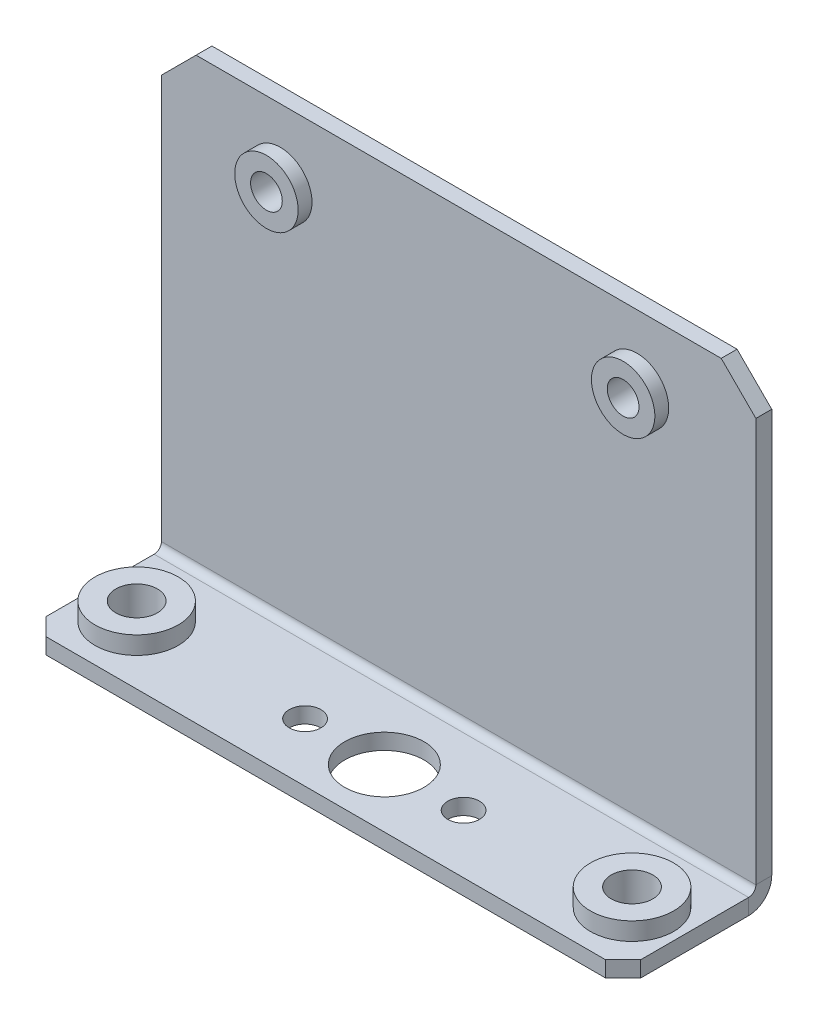
ISO-10303-21;
HEADER;
FILE_DESCRIPTION(('STEP AP214'),'2;1');
FILE_NAME('part.step','',(''),(''),'','','');
FILE_SCHEMA(('AUTOMOTIVE_DESIGN { 1 0 10303 214 1 1 1 1 }'));
ENDSEC;
DATA;
#1=APPLICATION_CONTEXT('core data for automotive mechanical design processes');
#2=APPLICATION_PROTOCOL_DEFINITION('international standard','automotive_design',2000,#1);
#3=PRODUCT_CONTEXT('',#1,'mechanical');
#4=PRODUCT('Part','Part','',(#3));
#5=PRODUCT_RELATED_PRODUCT_CATEGORY('part','',(#4));
#6=PRODUCT_DEFINITION_FORMATION('','',#4);
#7=PRODUCT_DEFINITION_CONTEXT('part definition',#1,'design');
#8=PRODUCT_DEFINITION('design','',#6,#7);
#9=PRODUCT_DEFINITION_SHAPE('','',#8);
#10=(LENGTH_UNIT() NAMED_UNIT(*) SI_UNIT(.MILLI.,.METRE.));
#11=(NAMED_UNIT(*) PLANE_ANGLE_UNIT() SI_UNIT($,.RADIAN.));
#12=(NAMED_UNIT(*) SI_UNIT($,.STERADIAN.) SOLID_ANGLE_UNIT());
#13=UNCERTAINTY_MEASURE_WITH_UNIT(LENGTH_MEASURE(1.E-05),#10,'distance_accuracy_value','');
#14=(GEOMETRIC_REPRESENTATION_CONTEXT(3) GLOBAL_UNCERTAINTY_ASSIGNED_CONTEXT((#13)) GLOBAL_UNIT_ASSIGNED_CONTEXT((#10,
#11,#12)) REPRESENTATION_CONTEXT('',''));
#15=CARTESIAN_POINT('',(0.,0.,0.));
#16=DIRECTION('',(0.,0.,1.));
#17=DIRECTION('',(1.,0.,0.));
#18=AXIS2_PLACEMENT_3D('',#15,#16,#17);
#19=CARTESIAN_POINT('',(30.,0.,0.));
#20=DIRECTION('',(0.,0.,1.));
#21=DIRECTION('',(1.,0.,0.));
#22=AXIS2_PLACEMENT_3D('',#19,#20,#21);
#23=PLANE('',#22);
#24=CARTESIAN_POINT('',(-18.,38.,0.));
#25=DIRECTION('',(0.,0.,1.));
#26=DIRECTION('',(1.,0.,0.));
#27=AXIS2_PLACEMENT_3D('',#24,#25,#26);
#28=CIRCLE('',#27,3.2);
#29=CARTESIAN_POINT('',(-14.8,38.,0.));
#30=VERTEX_POINT('',#29);
#31=EDGE_CURVE('E302',#30,#30,#28,.T.);
#32=ORIENTED_EDGE('',*,*,#31,.F.);
#33=EDGE_LOOP('',(#32));
#34=FACE_BOUND('',#33,.T.);
#35=DIRECTION('',(0.,-1.,0.));
#36=VECTOR('',#35,1.);
#37=CARTESIAN_POINT('',(-30.,41.5,0.));
#38=LINE('',#37,#36);
#39=CARTESIAN_POINT('',(-30.,41.5,0.));
#40=VERTEX_POINT('',#39);
#41=CARTESIAN_POINT('',(-30.,0.736599999999992,0.));
#42=VERTEX_POINT('',#41);
#43=EDGE_CURVE('E189',#40,#42,#38,.T.);
#44=ORIENTED_EDGE('',*,*,#43,.T.);
#45=DIRECTION('',(1.,0.,0.));
#46=VECTOR('',#45,1.);
#47=CARTESIAN_POINT('',(30.,0.736600000000001,0.));
#48=LINE('',#47,#46);
#49=CARTESIAN_POINT('',(30.,0.736599999999997,0.));
#50=VERTEX_POINT('',#49);
#51=EDGE_CURVE('E151',#50,#42,#48,.F.);
#52=ORIENTED_EDGE('',*,*,#51,.F.);
#53=DIRECTION('',(0.,1.,0.));
#54=VECTOR('',#53,1.);
#55=CARTESIAN_POINT('',(30.,41.5,0.));
#56=LINE('',#55,#54);
#57=CARTESIAN_POINT('',(30.,41.5,0.));
#58=VERTEX_POINT('',#57);
#59=EDGE_CURVE('E183',#50,#58,#56,.T.);
#60=ORIENTED_EDGE('',*,*,#59,.T.);
#61=DIRECTION('',(-0.707106781186547,0.707106781186547,0.));
#62=VECTOR('',#61,1.);
#63=CARTESIAN_POINT('',(26.5,45.,0.));
#64=LINE('',#63,#62);
#65=CARTESIAN_POINT('',(26.5,45.,0.));
#66=VERTEX_POINT('',#65);
#67=EDGE_CURVE('E202',#58,#66,#64,.T.);
#68=ORIENTED_EDGE('',*,*,#67,.T.);
#69=DIRECTION('',(-1.,0.,0.));
#70=VECTOR('',#69,1.);
#71=CARTESIAN_POINT('',(-26.5,45.,0.));
#72=LINE('',#71,#70);
#73=CARTESIAN_POINT('',(-26.5,45.,0.));
#74=VERTEX_POINT('',#73);
#75=EDGE_CURVE('E205',#66,#74,#72,.T.);
#76=ORIENTED_EDGE('',*,*,#75,.T.);
#77=DIRECTION('',(-0.707106781186547,-0.707106781186548,0.));
#78=VECTOR('',#77,1.);
#79=CARTESIAN_POINT('',(-30.,41.5,0.));
#80=LINE('',#79,#78);
#81=EDGE_CURVE('E208',#74,#40,#80,.T.);
#82=ORIENTED_EDGE('',*,*,#81,.T.);
#83=EDGE_LOOP('',(#44,#52,#60,#68,#76,#82));
#84=FACE_BOUND('',#83,.T.);
#85=CARTESIAN_POINT('',(18.,38.,0.));
#86=DIRECTION('',(0.,0.,1.));
#87=DIRECTION('',(-1.,0.,0.));
#88=AXIS2_PLACEMENT_3D('',#85,#86,#87);
#89=CIRCLE('',#88,3.2);
#90=CARTESIAN_POINT('',(14.8,38.,0.));
#91=VERTEX_POINT('',#90);
#92=EDGE_CURVE('E308',#91,#91,#89,.T.);
#93=ORIENTED_EDGE('',*,*,#92,.F.);
#94=EDGE_LOOP('',(#93));
#95=FACE_BOUND('',#94,.T.);
#96=ADVANCED_FACE('F36',(#34,#84,#95),#23,.T.);
#97=CARTESIAN_POINT('',(30.,0.,0.));
#98=DIRECTION('',(0.,1.,0.));
#99=DIRECTION('',(0.,0.,1.));
#100=AXIS2_PLACEMENT_3D('',#97,#98,#99);
#101=PLANE('',#100);
#102=CARTESIAN_POINT('',(-25.,0.,7.5));
#103=DIRECTION('',(0.,1.,0.));
#104=DIRECTION('',(0.,0.,1.));
#105=AXIS2_PLACEMENT_3D('',#102,#103,#104);
#106=CIRCLE('',#105,4.2);
#107=CARTESIAN_POINT('',(-25.,0.,11.7));
#108=VERTEX_POINT('',#107);
#109=EDGE_CURVE('E284',#108,#108,#106,.T.);
#110=ORIENTED_EDGE('',*,*,#109,.F.);
#111=EDGE_LOOP('',(#110));
#112=FACE_BOUND('',#111,.T.);
#113=CARTESIAN_POINT('',(0.,0.,7.5));
#114=DIRECTION('',(0.,1.,0.));
#115=DIRECTION('',(0.,0.,1.));
#116=AXIS2_PLACEMENT_3D('',#113,#114,#115);
#117=CIRCLE('',#116,4.);
#118=CARTESIAN_POINT('',(0.,0.,11.5));
#119=VERTEX_POINT('',#118);
#120=EDGE_CURVE('E271',#119,#119,#117,.T.);
#121=ORIENTED_EDGE('',*,*,#120,.F.);
#122=EDGE_LOOP('',(#121));
#123=FACE_BOUND('',#122,.T.);
#124=CARTESIAN_POINT('',(-7.99999999999999,0.,7.5));
#125=DIRECTION('',(0.,1.,0.));
#126=DIRECTION('',(0.,0.,1.));
#127=AXIS2_PLACEMENT_3D('',#124,#125,#126);
#128=CIRCLE('',#127,1.6);
#129=CARTESIAN_POINT('',(-7.99999999999999,0.,9.1));
#130=VERTEX_POINT('',#129);
#131=EDGE_CURVE('E265',#130,#130,#128,.T.);
#132=ORIENTED_EDGE('',*,*,#131,.F.);
#133=EDGE_LOOP('',(#132));
#134=FACE_BOUND('',#133,.T.);
#135=DIRECTION('',(0.,0.,-1.));
#136=VECTOR('',#135,1.);
#137=CARTESIAN_POINT('',(-30.,0.,0.));
#138=LINE('',#137,#136);
#139=CARTESIAN_POINT('',(-30.,0.,11.6224972892438));
#140=VERTEX_POINT('',#139);
#141=CARTESIAN_POINT('',(-30.,0.,0.736599999999996));
#142=VERTEX_POINT('',#141);
#143=EDGE_CURVE('E164',#140,#142,#138,.T.);
#144=ORIENTED_EDGE('',*,*,#143,.F.);
#145=DIRECTION('',(-0.707106781186555,0.,-0.707106781186539));
#146=VECTOR('',#145,1.);
#147=CARTESIAN_POINT('',(-30.,0.,11.6224972892439));
#148=LINE('',#147,#146);
#149=CARTESIAN_POINT('',(-28.2224972892438,0.,13.4));
#150=VERTEX_POINT('',#149);
#151=EDGE_CURVE('E53',#150,#140,#148,.T.);
#152=ORIENTED_EDGE('',*,*,#151,.F.);
#153=DIRECTION('',(-1.,0.,0.));
#154=VECTOR('',#153,1.);
#155=CARTESIAN_POINT('',(-30.,0.,13.4));
#156=LINE('',#155,#154);
#157=CARTESIAN_POINT('',(28.2224972892439,0.,13.4));
#158=VERTEX_POINT('',#157);
#159=EDGE_CURVE('E160',#158,#150,#156,.T.);
#160=ORIENTED_EDGE('',*,*,#159,.F.);
#161=DIRECTION('',(-0.70710678118654,0.,0.707106781186555));
#162=VECTOR('',#161,1.);
#163=CARTESIAN_POINT('',(30.,0.,11.6224972892439));
#164=LINE('',#163,#162);
#165=CARTESIAN_POINT('',(30.,0.,11.6224972892439));
#166=VERTEX_POINT('',#165);
#167=EDGE_CURVE('E61',#166,#158,#164,.T.);
#168=ORIENTED_EDGE('',*,*,#167,.F.);
#169=DIRECTION('',(0.,0.,1.));
#170=VECTOR('',#169,1.);
#171=CARTESIAN_POINT('',(30.,0.,13.4));
#172=LINE('',#171,#170);
#173=CARTESIAN_POINT('',(30.,0.,0.736600000000001));
#174=VERTEX_POINT('',#173);
#175=EDGE_CURVE('E157',#174,#166,#172,.T.);
#176=ORIENTED_EDGE('',*,*,#175,.F.);
#177=DIRECTION('',(1.,0.,0.));
#178=VECTOR('',#177,1.);
#179=CARTESIAN_POINT('',(-30.,0.,0.736599999999997));
#180=LINE('',#179,#178);
#181=EDGE_CURVE('E235',#142,#174,#180,.T.);
#182=ORIENTED_EDGE('',*,*,#181,.F.);
#183=EDGE_LOOP('',(#144,#152,#160,#168,#176,#182));
#184=FACE_BOUND('',#183,.T.);
#185=CARTESIAN_POINT('',(7.99999999999999,0.,7.5));
#186=DIRECTION('',(0.,1.,0.));
#187=DIRECTION('',(0.,0.,1.));
#188=AXIS2_PLACEMENT_3D('',#185,#186,#187);
#189=CIRCLE('',#188,1.6);
#190=CARTESIAN_POINT('',(7.99999999999999,0.,9.1));
#191=VERTEX_POINT('',#190);
#192=EDGE_CURVE('E280',#191,#191,#189,.F.);
#193=ORIENTED_EDGE('',*,*,#192,.T.);
#194=EDGE_LOOP('',(#193));
#195=FACE_BOUND('',#194,.T.);
#196=CARTESIAN_POINT('',(25.,0.,7.49999999999999));
#197=DIRECTION('',(0.,1.,0.));
#198=DIRECTION('',(0.,0.,-1.));
#199=AXIS2_PLACEMENT_3D('',#196,#197,#198);
#200=CIRCLE('',#199,4.2);
#201=CARTESIAN_POINT('',(25.,0.,3.29999999999999));
#202=VERTEX_POINT('',#201);
#203=EDGE_CURVE('E293',#202,#202,#200,.T.);
#204=ORIENTED_EDGE('',*,*,#203,.F.);
#205=EDGE_LOOP('',(#204));
#206=FACE_BOUND('',#205,.T.);
#207=ADVANCED_FACE('F349',(#112,#123,#134,#184,#195,#206),#101,.T.);
#208=CARTESIAN_POINT('',(30.,-1.6,0.));
#209=DIRECTION('',(0.,1.,0.));
#210=DIRECTION('',(0.,0.,1.));
#211=AXIS2_PLACEMENT_3D('',#208,#209,#210);
#212=PLANE('',#211);
#213=CARTESIAN_POINT('',(25.,-1.60000000000002,7.49999999999999));
#214=DIRECTION('',(0.,1.,0.));
#215=DIRECTION('',(0.,0.,1.));
#216=AXIS2_PLACEMENT_3D('',#213,#214,#215);
#217=CIRCLE('',#216,2.1);
#218=CARTESIAN_POINT('',(25.,-1.60000000000003,9.59999999999999));
#219=VERTEX_POINT('',#218);
#220=EDGE_CURVE('E274',#219,#219,#217,.F.);
#221=ORIENTED_EDGE('',*,*,#220,.F.);
#222=EDGE_LOOP('',(#221));
#223=FACE_BOUND('',#222,.T.);
#224=CARTESIAN_POINT('',(0.,-1.60000000000003,7.49999999999999));
#225=DIRECTION('',(0.,1.,0.));
#226=DIRECTION('',(0.,0.,1.));
#227=AXIS2_PLACEMENT_3D('',#224,#225,#226);
#228=CIRCLE('',#227,4.);
#229=CARTESIAN_POINT('',(0.,-1.60000000000004,11.5));
#230=VERTEX_POINT('',#229);
#231=EDGE_CURVE('E268',#230,#230,#228,.T.);
#232=ORIENTED_EDGE('',*,*,#231,.T.);
#233=EDGE_LOOP('',(#232));
#234=FACE_BOUND('',#233,.T.);
#235=CARTESIAN_POINT('',(-7.99999999999999,-1.60000000000003,7.49999999999999));
#236=DIRECTION('',(0.,1.,0.));
#237=DIRECTION('',(0.,0.,1.));
#238=AXIS2_PLACEMENT_3D('',#235,#236,#237);
#239=CIRCLE('',#238,1.6);
#240=CARTESIAN_POINT('',(-7.99999999999999,-1.60000000000003,9.09999999999999));
#241=VERTEX_POINT('',#240);
#242=EDGE_CURVE('E262',#241,#241,#239,.T.);
#243=ORIENTED_EDGE('',*,*,#242,.T.);
#244=EDGE_LOOP('',(#243));
#245=FACE_BOUND('',#244,.T.);
#246=CARTESIAN_POINT('',(-25.,-1.60000000000003,7.49999999999999));
#247=DIRECTION('',(0.,1.,0.));
#248=DIRECTION('',(0.,0.,1.));
#249=AXIS2_PLACEMENT_3D('',#246,#247,#248);
#250=CIRCLE('',#249,2.1);
#251=CARTESIAN_POINT('',(-25.,-1.60000000000004,9.6));
#252=VERTEX_POINT('',#251);
#253=EDGE_CURVE('E258',#252,#252,#250,.T.);
#254=ORIENTED_EDGE('',*,*,#253,.T.);
#255=EDGE_LOOP('',(#254));
#256=FACE_BOUND('',#255,.T.);
#257=DIRECTION('',(-0.707106781186555,0.,-0.707106781186539));
#258=VECTOR('',#257,1.);
#259=CARTESIAN_POINT('',(-30.,-1.60000000000004,11.6224972892438));
#260=LINE('',#259,#258);
#261=CARTESIAN_POINT('',(-28.2224972892438,-1.60000000000005,13.4));
#262=VERTEX_POINT('',#261);
#263=CARTESIAN_POINT('',(-30.,-1.60000000000004,11.6224972892438));
#264=VERTEX_POINT('',#263);
#265=EDGE_CURVE('E126',#262,#264,#260,.T.);
#266=ORIENTED_EDGE('',*,*,#265,.T.);
#267=DIRECTION('',(0.,0.,-1.));
#268=VECTOR('',#267,1.);
#269=CARTESIAN_POINT('',(-30.,-1.6,0.));
#270=LINE('',#269,#268);
#271=CARTESIAN_POINT('',(-30.,-1.60000000000001,0.736599999999991));
#272=VERTEX_POINT('',#271);
#273=EDGE_CURVE('E138',#264,#272,#270,.T.);
#274=ORIENTED_EDGE('',*,*,#273,.T.);
#275=DIRECTION('',(-1.,0.,0.));
#276=VECTOR('',#275,1.);
#277=CARTESIAN_POINT('',(30.,-1.6,0.736599999999994));
#278=LINE('',#277,#276);
#279=CARTESIAN_POINT('',(30.,-1.6,0.736599999999994));
#280=VERTEX_POINT('',#279);
#281=EDGE_CURVE('E161',#280,#272,#278,.T.);
#282=ORIENTED_EDGE('',*,*,#281,.F.);
#283=DIRECTION('',(0.,0.,1.));
#284=VECTOR('',#283,1.);
#285=CARTESIAN_POINT('',(30.,-1.60000000000004,13.4));
#286=LINE('',#285,#284);
#287=CARTESIAN_POINT('',(30.,-1.60000000000004,11.6224972892438));
#288=VERTEX_POINT('',#287);
#289=EDGE_CURVE('E153',#280,#288,#286,.T.);
#290=ORIENTED_EDGE('',*,*,#289,.T.);
#291=DIRECTION('',(-0.70710678118654,0.,0.707106781186555));
#292=VECTOR('',#291,1.);
#293=CARTESIAN_POINT('',(30.,-1.60000000000004,11.6224972892438));
#294=LINE('',#293,#292);
#295=CARTESIAN_POINT('',(28.2224972892439,-1.60000000000004,13.4));
#296=VERTEX_POINT('',#295);
#297=EDGE_CURVE('E246',#288,#296,#294,.T.);
#298=ORIENTED_EDGE('',*,*,#297,.T.);
#299=DIRECTION('',(-1.,0.,0.));
#300=VECTOR('',#299,1.);
#301=CARTESIAN_POINT('',(-30.,-1.60000000000005,13.4));
#302=LINE('',#301,#300);
#303=EDGE_CURVE('E142',#296,#262,#302,.T.);
#304=ORIENTED_EDGE('',*,*,#303,.T.);
#305=EDGE_LOOP('',(#266,#274,#282,#290,#298,#304));
#306=FACE_BOUND('',#305,.T.);
#307=CARTESIAN_POINT('',(7.99999999999999,-1.60000000000003,7.49999999999999));
#308=DIRECTION('',(0.,1.,0.));
#309=DIRECTION('',(0.,0.,1.));
#310=AXIS2_PLACEMENT_3D('',#307,#308,#309);
#311=CIRCLE('',#310,1.6);
#312=CARTESIAN_POINT('',(7.99999999999999,-1.60000000000003,9.09999999999999));
#313=VERTEX_POINT('',#312);
#314=EDGE_CURVE('E277',#313,#313,#311,.F.);
#315=ORIENTED_EDGE('',*,*,#314,.F.);
#316=EDGE_LOOP('',(#315));
#317=FACE_BOUND('',#316,.T.);
#318=ADVANCED_FACE('F135',(#223,#234,#245,#256,#306,#317),#212,.F.);
#319=CARTESIAN_POINT('',(-30.,-1.60000000000005,13.4));
#320=DIRECTION('',(0.,0.,-1.));
#321=DIRECTION('',(0.,1.,0.));
#322=AXIS2_PLACEMENT_3D('',#319,#320,#321);
#323=PLANE('',#322);
#324=DIRECTION('',(0.,1.,0.));
#325=VECTOR('',#324,1.);
#326=CARTESIAN_POINT('',(-28.2224972892438,0.,13.4));
#327=LINE('',#326,#325);
#328=EDGE_CURVE('E131',#150,#262,#327,.F.);
#329=ORIENTED_EDGE('',*,*,#328,.T.);
#330=ORIENTED_EDGE('',*,*,#303,.F.);
#331=DIRECTION('',(0.,1.,0.));
#332=VECTOR('',#331,1.);
#333=CARTESIAN_POINT('',(28.2224972892439,0.,13.4));
#334=LINE('',#333,#332);
#335=EDGE_CURVE('E236',#158,#296,#334,.F.);
#336=ORIENTED_EDGE('',*,*,#335,.F.);
#337=ORIENTED_EDGE('',*,*,#159,.T.);
#338=EDGE_LOOP('',(#329,#330,#336,#337));
#339=FACE_BOUND('',#338,.T.);
#340=ADVANCED_FACE('F392',(#339),#323,.F.);
#341=CARTESIAN_POINT('',(-30.,-1.6,0.));
#342=DIRECTION('',(1.,0.,0.));
#343=DIRECTION('',(0.,1.,0.));
#344=AXIS2_PLACEMENT_3D('',#341,#342,#343);
#345=PLANE('',#344);
#346=DIRECTION('',(0.,1.,0.));
#347=VECTOR('',#346,1.);
#348=CARTESIAN_POINT('',(-30.,0.,11.6224972892439));
#349=LINE('',#348,#347);
#350=EDGE_CURVE('E123',#140,#264,#349,.F.);
#351=ORIENTED_EDGE('',*,*,#350,.F.);
#352=ORIENTED_EDGE('',*,*,#143,.T.);
#353=DIRECTION('',(0.,-1.,0.));
#354=VECTOR('',#353,1.);
#355=CARTESIAN_POINT('',(-30.,0.,0.736599999999997));
#356=LINE('',#355,#354);
#357=EDGE_CURVE('E147',#142,#272,#356,.T.);
#358=ORIENTED_EDGE('',*,*,#357,.T.);
#359=ORIENTED_EDGE('',*,*,#273,.F.);
#360=EDGE_LOOP('',(#351,#352,#358,#359));
#361=FACE_BOUND('',#360,.T.);
#362=ADVANCED_FACE('F145',(#361),#345,.F.);
#363=CARTESIAN_POINT('',(30.,-1.60000000000004,13.4));
#364=DIRECTION('',(-1.,0.,0.));
#365=DIRECTION('',(0.,-1.,0.));
#366=AXIS2_PLACEMENT_3D('',#363,#364,#365);
#367=PLANE('',#366);
#368=DIRECTION('',(0.,1.,0.));
#369=VECTOR('',#368,1.);
#370=CARTESIAN_POINT('',(30.,0.,11.6224972892439));
#371=LINE('',#370,#369);
#372=EDGE_CURVE('E240',#166,#288,#371,.F.);
#373=ORIENTED_EDGE('',*,*,#372,.T.);
#374=ORIENTED_EDGE('',*,*,#289,.F.);
#375=DIRECTION('',(0.,-1.,0.));
#376=VECTOR('',#375,1.);
#377=CARTESIAN_POINT('',(30.,0.,0.7366));
#378=LINE('',#377,#376);
#379=EDGE_CURVE('E238',#174,#280,#378,.T.);
#380=ORIENTED_EDGE('',*,*,#379,.F.);
#381=ORIENTED_EDGE('',*,*,#175,.T.);
#382=EDGE_LOOP('',(#373,#374,#380,#381));
#383=FACE_BOUND('',#382,.T.);
#384=ADVANCED_FACE('F250',(#383),#367,.F.);
#385=CARTESIAN_POINT('',(30.,41.5,-1.6));
#386=DIRECTION('',(1.,0.,0.));
#387=DIRECTION('',(0.,1.,0.));
#388=AXIS2_PLACEMENT_3D('',#385,#386,#387);
#389=PLANE('',#388);
#390=ORIENTED_EDGE('',*,*,#59,.F.);
#391=DIRECTION('',(0.,0.,-1.));
#392=VECTOR('',#391,1.);
#393=CARTESIAN_POINT('',(30.,0.736600000000001,0.));
#394=LINE('',#393,#392);
#395=CARTESIAN_POINT('',(30.,0.736599999999999,-1.6));
#396=VERTEX_POINT('',#395);
#397=EDGE_CURVE('E172',#50,#396,#394,.T.);
#398=ORIENTED_EDGE('',*,*,#397,.T.);
#399=DIRECTION('',(0.,1.,0.));
#400=VECTOR('',#399,1.);
#401=CARTESIAN_POINT('',(30.,41.5,-1.6));
#402=LINE('',#401,#400);
#403=CARTESIAN_POINT('',(30.,41.5,-1.6));
#404=VERTEX_POINT('',#403);
#405=EDGE_CURVE('E186',#396,#404,#402,.T.);
#406=ORIENTED_EDGE('',*,*,#405,.T.);
#407=DIRECTION('',(0.,0.,1.));
#408=VECTOR('',#407,1.);
#409=CARTESIAN_POINT('',(30.,41.5,-1.6));
#410=LINE('',#409,#408);
#411=EDGE_CURVE('E40',#404,#58,#410,.T.);
#412=ORIENTED_EDGE('',*,*,#411,.T.);
#413=EDGE_LOOP('',(#390,#398,#406,#412));
#414=FACE_BOUND('',#413,.T.);
#415=ADVANCED_FACE('F38',(#414),#389,.T.);
#416=CARTESIAN_POINT('',(30.,0.,-1.6));
#417=DIRECTION('',(0.,0.,1.));
#418=DIRECTION('',(1.,0.,0.));
#419=AXIS2_PLACEMENT_3D('',#416,#417,#418);
#420=PLANE('',#419);
#421=CARTESIAN_POINT('',(18.,38.,-1.6));
#422=DIRECTION('',(0.,0.,1.));
#423=DIRECTION('',(-1.,0.,0.));
#424=AXIS2_PLACEMENT_3D('',#421,#422,#423);
#425=CIRCLE('',#424,1.6);
#426=CARTESIAN_POINT('',(16.4,38.,-1.6));
#427=VERTEX_POINT('',#426);
#428=EDGE_CURVE('E317',#427,#427,#425,.T.);
#429=ORIENTED_EDGE('',*,*,#428,.T.);
#430=EDGE_LOOP('',(#429));
#431=FACE_BOUND('',#430,.T.);
#432=CARTESIAN_POINT('',(-18.,38.,-1.6));
#433=DIRECTION('',(0.,0.,1.));
#434=DIRECTION('',(1.,0.,0.));
#435=AXIS2_PLACEMENT_3D('',#432,#433,#434);
#436=CIRCLE('',#435,1.6);
#437=CARTESIAN_POINT('',(-16.4,38.,-1.6));
#438=VERTEX_POINT('',#437);
#439=EDGE_CURVE('E311',#438,#438,#436,.T.);
#440=ORIENTED_EDGE('',*,*,#439,.T.);
#441=EDGE_LOOP('',(#440));
#442=FACE_BOUND('',#441,.T.);
#443=DIRECTION('',(1.,0.,0.));
#444=VECTOR('',#443,1.);
#445=CARTESIAN_POINT('',(30.,0.736599999999999,-1.6));
#446=LINE('',#445,#444);
#447=CARTESIAN_POINT('',(-30.,0.736600000000003,-1.6));
#448=VERTEX_POINT('',#447);
#449=EDGE_CURVE('E166',#396,#448,#446,.F.);
#450=ORIENTED_EDGE('',*,*,#449,.T.);
#451=DIRECTION('',(0.,-1.,0.));
#452=VECTOR('',#451,1.);
#453=CARTESIAN_POINT('',(-30.,41.5,-1.6));
#454=LINE('',#453,#452);
#455=CARTESIAN_POINT('',(-30.,41.5,-1.6));
#456=VERTEX_POINT('',#455);
#457=EDGE_CURVE('E198',#456,#448,#454,.T.);
#458=ORIENTED_EDGE('',*,*,#457,.F.);
#459=DIRECTION('',(-0.707106781186547,-0.707106781186548,0.));
#460=VECTOR('',#459,1.);
#461=CARTESIAN_POINT('',(-30.,41.5,-1.6));
#462=LINE('',#461,#460);
#463=CARTESIAN_POINT('',(-26.5,45.,-1.6));
#464=VERTEX_POINT('',#463);
#465=EDGE_CURVE('E195',#464,#456,#462,.T.);
#466=ORIENTED_EDGE('',*,*,#465,.F.);
#467=DIRECTION('',(-1.,0.,0.));
#468=VECTOR('',#467,1.);
#469=CARTESIAN_POINT('',(-26.5,45.,-1.6));
#470=LINE('',#469,#468);
#471=CARTESIAN_POINT('',(26.5,45.,-1.6));
#472=VERTEX_POINT('',#471);
#473=EDGE_CURVE('E192',#472,#464,#470,.T.);
#474=ORIENTED_EDGE('',*,*,#473,.F.);
#475=DIRECTION('',(-0.707106781186547,0.707106781186547,0.));
#476=VECTOR('',#475,1.);
#477=CARTESIAN_POINT('',(26.5,45.,-1.6));
#478=LINE('',#477,#476);
#479=EDGE_CURVE('E188',#404,#472,#478,.T.);
#480=ORIENTED_EDGE('',*,*,#479,.F.);
#481=ORIENTED_EDGE('',*,*,#405,.F.);
#482=EDGE_LOOP('',(#450,#458,#466,#474,#480,#481));
#483=FACE_BOUND('',#482,.T.);
#484=ADVANCED_FACE('F326',(#431,#442,#483),#420,.F.);
#485=CARTESIAN_POINT('',(-30.,41.5,-1.6));
#486=DIRECTION('',(-1.,0.,0.));
#487=DIRECTION('',(0.,0.,1.));
#488=AXIS2_PLACEMENT_3D('',#485,#486,#487);
#489=PLANE('',#488);
#490=DIRECTION('',(0.,0.,-1.));
#491=VECTOR('',#490,1.);
#492=CARTESIAN_POINT('',(-30.,0.736599999999992,0.));
#493=LINE('',#492,#491);
#494=EDGE_CURVE('E180',#42,#448,#493,.T.);
#495=ORIENTED_EDGE('',*,*,#494,.F.);
#496=ORIENTED_EDGE('',*,*,#43,.F.);
#497=DIRECTION('',(0.,0.,1.));
#498=VECTOR('',#497,1.);
#499=CARTESIAN_POINT('',(-30.,41.5,-1.6));
#500=LINE('',#499,#498);
#501=EDGE_CURVE('E11',#456,#40,#500,.T.);
#502=ORIENTED_EDGE('',*,*,#501,.F.);
#503=ORIENTED_EDGE('',*,*,#457,.T.);
#504=EDGE_LOOP('',(#495,#496,#502,#503));
#505=FACE_BOUND('',#504,.T.);
#506=ADVANCED_FACE('F361',(#505),#489,.T.);
#507=CARTESIAN_POINT('',(-30.,41.5,-1.6));
#508=DIRECTION('',(-0.707106781186548,0.707106781186547,0.));
#509=DIRECTION('',(-0.707106781186547,-0.707106781186548,0.));
#510=AXIS2_PLACEMENT_3D('',#507,#508,#509);
#511=PLANE('',#510);
#512=ORIENTED_EDGE('',*,*,#81,.F.);
#513=DIRECTION('',(0.,0.,1.));
#514=VECTOR('',#513,1.);
#515=CARTESIAN_POINT('',(-26.5,45.,-1.6));
#516=LINE('',#515,#514);
#517=EDGE_CURVE('E45',#464,#74,#516,.T.);
#518=ORIENTED_EDGE('',*,*,#517,.F.);
#519=ORIENTED_EDGE('',*,*,#465,.T.);
#520=ORIENTED_EDGE('',*,*,#501,.T.);
#521=EDGE_LOOP('',(#512,#518,#519,#520));
#522=FACE_BOUND('',#521,.T.);
#523=ADVANCED_FACE('F364',(#522),#511,.T.);
#524=CARTESIAN_POINT('',(-26.5,45.,-1.6));
#525=DIRECTION('',(0.,1.,0.));
#526=DIRECTION('',(0.,0.,1.));
#527=AXIS2_PLACEMENT_3D('',#524,#525,#526);
#528=PLANE('',#527);
#529=ORIENTED_EDGE('',*,*,#75,.F.);
#530=DIRECTION('',(0.,0.,1.));
#531=VECTOR('',#530,1.);
#532=CARTESIAN_POINT('',(26.5,45.,-1.6));
#533=LINE('',#532,#531);
#534=EDGE_CURVE('E213',#472,#66,#533,.T.);
#535=ORIENTED_EDGE('',*,*,#534,.F.);
#536=ORIENTED_EDGE('',*,*,#473,.T.);
#537=ORIENTED_EDGE('',*,*,#517,.T.);
#538=EDGE_LOOP('',(#529,#535,#536,#537));
#539=FACE_BOUND('',#538,.T.);
#540=ADVANCED_FACE('F368',(#539),#528,.T.);
#541=CARTESIAN_POINT('',(26.5,45.,-1.6));
#542=DIRECTION('',(0.707106781186548,0.707106781186548,0.));
#543=DIRECTION('',(-0.707106781186548,0.707106781186548,0.));
#544=AXIS2_PLACEMENT_3D('',#541,#542,#543);
#545=PLANE('',#544);
#546=ORIENTED_EDGE('',*,*,#67,.F.);
#547=ORIENTED_EDGE('',*,*,#411,.F.);
#548=ORIENTED_EDGE('',*,*,#479,.T.);
#549=ORIENTED_EDGE('',*,*,#534,.T.);
#550=EDGE_LOOP('',(#546,#547,#548,#549));
#551=FACE_BOUND('',#550,.T.);
#552=ADVANCED_FACE('F223',(#551),#545,.T.);
#553=CARTESIAN_POINT('',(-30.,0.736599999999993,0.736599999999999));
#554=DIRECTION('',(-1.,0.,0.));
#555=DIRECTION('',(0.,-1.,0.));
#556=AXIS2_PLACEMENT_3D('',#553,#554,#555);
#557=PLANE('',#556);
#558=ORIENTED_EDGE('',*,*,#357,.F.);
#559=CARTESIAN_POINT('',(-30.,0.736599999999993,0.736599999999999));
#560=DIRECTION('',(1.,0.,0.));
#561=DIRECTION('',(0.,1.,0.));
#562=AXIS2_PLACEMENT_3D('',#559,#560,#561);
#563=CIRCLE('',#562,0.736599999999999);
#564=EDGE_CURVE('E175',#42,#142,#563,.F.);
#565=ORIENTED_EDGE('',*,*,#564,.F.);
#566=ORIENTED_EDGE('',*,*,#494,.T.);
#567=CARTESIAN_POINT('',(-30.,0.736599999999993,0.736599999999999));
#568=DIRECTION('',(1.,0.,0.));
#569=DIRECTION('',(0.,1.,0.));
#570=AXIS2_PLACEMENT_3D('',#567,#568,#569);
#571=CIRCLE('',#570,2.3366);
#572=EDGE_CURVE('E168',#448,#272,#571,.F.);
#573=ORIENTED_EDGE('',*,*,#572,.T.);
#574=EDGE_LOOP('',(#558,#565,#566,#573));
#575=FACE_BOUND('',#574,.T.);
#576=ADVANCED_FACE('F233',(#575),#557,.T.);
#577=CARTESIAN_POINT('',(30.,0.736600000000002,0.736600000000003));
#578=DIRECTION('',(-1.,0.,0.));
#579=DIRECTION('',(0.,-1.,0.));
#580=AXIS2_PLACEMENT_3D('',#577,#578,#579);
#581=PLANE('',#580);
#582=CARTESIAN_POINT('',(30.,0.736600000000002,0.736600000000003));
#583=DIRECTION('',(1.,0.,0.));
#584=DIRECTION('',(0.,1.,0.));
#585=AXIS2_PLACEMENT_3D('',#582,#583,#584);
#586=CIRCLE('',#585,0.736599999999999);
#587=EDGE_CURVE('E148',#174,#50,#586,.T.);
#588=ORIENTED_EDGE('',*,*,#587,.F.);
#589=ORIENTED_EDGE('',*,*,#379,.T.);
#590=CARTESIAN_POINT('',(30.,0.736600000000002,0.736600000000003));
#591=DIRECTION('',(1.,0.,0.));
#592=DIRECTION('',(0.,1.,0.));
#593=AXIS2_PLACEMENT_3D('',#590,#591,#592);
#594=CIRCLE('',#593,2.3366);
#595=EDGE_CURVE('E169',#280,#396,#594,.T.);
#596=ORIENTED_EDGE('',*,*,#595,.T.);
#597=ORIENTED_EDGE('',*,*,#397,.F.);
#598=EDGE_LOOP('',(#588,#589,#596,#597));
#599=FACE_BOUND('',#598,.T.);
#600=ADVANCED_FACE('F376',(#599),#581,.F.);
#601=CARTESIAN_POINT('',(30.,0.736600000000002,0.736600000000003));
#602=DIRECTION('',(1.,0.,0.));
#603=DIRECTION('',(0.,-1.,0.));
#604=AXIS2_PLACEMENT_3D('',#601,#602,#603);
#605=CYLINDRICAL_SURFACE('',#604,2.3366);
#606=ORIENTED_EDGE('',*,*,#449,.F.);
#607=ORIENTED_EDGE('',*,*,#595,.F.);
#608=ORIENTED_EDGE('',*,*,#281,.T.);
#609=ORIENTED_EDGE('',*,*,#572,.F.);
#610=EDGE_LOOP('',(#606,#607,#608,#609));
#611=FACE_BOUND('',#610,.T.);
#612=ADVANCED_FACE('F381',(#611),#605,.T.);
#613=CARTESIAN_POINT('',(30.,0.736600000000002,0.736600000000003));
#614=DIRECTION('',(1.,0.,0.));
#615=DIRECTION('',(0.,-1.,0.));
#616=AXIS2_PLACEMENT_3D('',#613,#614,#615);
#617=CYLINDRICAL_SURFACE('',#616,0.736599999999999);
#618=ORIENTED_EDGE('',*,*,#51,.T.);
#619=ORIENTED_EDGE('',*,*,#564,.T.);
#620=ORIENTED_EDGE('',*,*,#181,.T.);
#621=ORIENTED_EDGE('',*,*,#587,.T.);
#622=EDGE_LOOP('',(#618,#619,#620,#621));
#623=FACE_BOUND('',#622,.T.);
#624=ADVANCED_FACE('F229',(#623),#617,.F.);
#625=CARTESIAN_POINT('',(30.,0.,11.6224972892439));
#626=DIRECTION('',(-0.707106781186555,0.,-0.70710678118654));
#627=DIRECTION('',(-0.70710678118654,0.,0.707106781186555));
#628=AXIS2_PLACEMENT_3D('',#625,#626,#627);
#629=PLANE('',#628);
#630=ORIENTED_EDGE('',*,*,#167,.T.);
#631=ORIENTED_EDGE('',*,*,#335,.T.);
#632=ORIENTED_EDGE('',*,*,#297,.F.);
#633=ORIENTED_EDGE('',*,*,#372,.F.);
#634=EDGE_LOOP('',(#630,#631,#632,#633));
#635=FACE_BOUND('',#634,.T.);
#636=ADVANCED_FACE('F386',(#635),#629,.F.);
#637=CARTESIAN_POINT('',(-30.,0.,11.6224972892439));
#638=DIRECTION('',(0.70710678118654,0.,-0.707106781186555));
#639=DIRECTION('',(-0.707106781186555,0.,-0.707106781186539));
#640=AXIS2_PLACEMENT_3D('',#637,#638,#639);
#641=PLANE('',#640);
#642=ORIENTED_EDGE('',*,*,#151,.T.);
#643=ORIENTED_EDGE('',*,*,#350,.T.);
#644=ORIENTED_EDGE('',*,*,#265,.F.);
#645=ORIENTED_EDGE('',*,*,#328,.F.);
#646=EDGE_LOOP('',(#642,#643,#644,#645));
#647=FACE_BOUND('',#646,.T.);
#648=ADVANCED_FACE('F125',(#647),#641,.F.);
#649=CARTESIAN_POINT('',(-25.,-10.,7.49999999999997));
#650=DIRECTION('',(0.,1.,0.));
#651=DIRECTION('',(0.,0.,1.));
#652=AXIS2_PLACEMENT_3D('',#649,#650,#651);
#653=CYLINDRICAL_SURFACE('',#652,2.1);
#654=ORIENTED_EDGE('',*,*,#253,.F.);
#655=EDGE_LOOP('',(#654));
#656=FACE_BOUND('',#655,.T.);
#657=CARTESIAN_POINT('',(-25.,1.79999999999997,7.50000000000001));
#658=DIRECTION('',(0.,1.,0.));
#659=DIRECTION('',(0.,0.,1.));
#660=AXIS2_PLACEMENT_3D('',#657,#658,#659);
#661=CIRCLE('',#660,2.1);
#662=CARTESIAN_POINT('',(-25.,1.79999999999996,9.60000000000001));
#663=VERTEX_POINT('',#662);
#664=EDGE_CURVE('E287',#663,#663,#661,.T.);
#665=ORIENTED_EDGE('',*,*,#664,.T.);
#666=EDGE_LOOP('',(#665));
#667=FACE_BOUND('',#666,.T.);
#668=ADVANCED_FACE('F405',(#656,#667),#653,.F.);
#669=CARTESIAN_POINT('',(-7.99999999999999,-10.,7.49999999999997));
#670=DIRECTION('',(0.,1.,0.));
#671=DIRECTION('',(0.,0.,1.));
#672=AXIS2_PLACEMENT_3D('',#669,#670,#671);
#673=CYLINDRICAL_SURFACE('',#672,1.6);
#674=ORIENTED_EDGE('',*,*,#131,.T.);
#675=EDGE_LOOP('',(#674));
#676=FACE_BOUND('',#675,.T.);
#677=ORIENTED_EDGE('',*,*,#242,.F.);
#678=EDGE_LOOP('',(#677));
#679=FACE_BOUND('',#678,.T.);
#680=ADVANCED_FACE('F408',(#676,#679),#673,.F.);
#681=CARTESIAN_POINT('',(0.,-10.,7.49999999999997));
#682=DIRECTION('',(0.,1.,0.));
#683=DIRECTION('',(0.,0.,1.));
#684=AXIS2_PLACEMENT_3D('',#681,#682,#683);
#685=CYLINDRICAL_SURFACE('',#684,4.);
#686=ORIENTED_EDGE('',*,*,#120,.T.);
#687=EDGE_LOOP('',(#686));
#688=FACE_BOUND('',#687,.T.);
#689=ORIENTED_EDGE('',*,*,#231,.F.);
#690=EDGE_LOOP('',(#689));
#691=FACE_BOUND('',#690,.T.);
#692=ADVANCED_FACE('F412',(#688,#691),#685,.F.);
#693=CARTESIAN_POINT('',(25.,-10.,7.49999999999996));
#694=DIRECTION('',(0.,1.,0.));
#695=DIRECTION('',(0.,0.,1.));
#696=AXIS2_PLACEMENT_3D('',#693,#694,#695);
#697=CYLINDRICAL_SURFACE('',#696,2.1);
#698=ORIENTED_EDGE('',*,*,#220,.T.);
#699=EDGE_LOOP('',(#698));
#700=FACE_BOUND('',#699,.T.);
#701=CARTESIAN_POINT('',(25.,1.79999999999998,7.5));
#702=DIRECTION('',(0.,1.,0.));
#703=DIRECTION('',(0.,0.,-1.));
#704=AXIS2_PLACEMENT_3D('',#701,#702,#703);
#705=CIRCLE('',#704,2.1);
#706=CARTESIAN_POINT('',(25.,1.79999999999998,5.4));
#707=VERTEX_POINT('',#706);
#708=EDGE_CURVE('E296',#707,#707,#705,.T.);
#709=ORIENTED_EDGE('',*,*,#708,.T.);
#710=EDGE_LOOP('',(#709));
#711=FACE_BOUND('',#710,.T.);
#712=ADVANCED_FACE('F416',(#700,#711),#697,.F.);
#713=CARTESIAN_POINT('',(7.99999999999999,-10.,7.49999999999997));
#714=DIRECTION('',(0.,1.,0.));
#715=DIRECTION('',(0.,0.,1.));
#716=AXIS2_PLACEMENT_3D('',#713,#714,#715);
#717=CYLINDRICAL_SURFACE('',#716,1.6);
#718=ORIENTED_EDGE('',*,*,#192,.F.);
#719=EDGE_LOOP('',(#718));
#720=FACE_BOUND('',#719,.T.);
#721=ORIENTED_EDGE('',*,*,#314,.T.);
#722=EDGE_LOOP('',(#721));
#723=FACE_BOUND('',#722,.T.);
#724=ADVANCED_FACE('F420',(#720,#723),#717,.F.);
#725=CARTESIAN_POINT('',(-25.,1.79999999999997,7.50000000000001));
#726=DIRECTION('',(0.,1.,0.));
#727=DIRECTION('',(0.,0.,1.));
#728=AXIS2_PLACEMENT_3D('',#725,#726,#727);
#729=PLANE('',#728);
#730=CARTESIAN_POINT('',(-25.,1.79999999999997,7.50000000000001));
#731=DIRECTION('',(0.,1.,0.));
#732=DIRECTION('',(0.,0.,1.));
#733=AXIS2_PLACEMENT_3D('',#730,#731,#732);
#734=CIRCLE('',#733,4.2);
#735=CARTESIAN_POINT('',(-25.,1.79999999999996,11.7));
#736=VERTEX_POINT('',#735);
#737=EDGE_CURVE('E283',#736,#736,#734,.T.);
#738=ORIENTED_EDGE('',*,*,#737,.T.);
#739=EDGE_LOOP('',(#738));
#740=FACE_BOUND('',#739,.T.);
#741=ORIENTED_EDGE('',*,*,#664,.F.);
#742=EDGE_LOOP('',(#741));
#743=FACE_BOUND('',#742,.T.);
#744=ADVANCED_FACE('F424',(#740,#743),#729,.T.);
#745=CARTESIAN_POINT('',(-25.,1.79999999999997,7.50000000000001));
#746=DIRECTION('',(0.,-1.,0.));
#747=DIRECTION('',(0.,0.,-1.));
#748=AXIS2_PLACEMENT_3D('',#745,#746,#747);
#749=CYLINDRICAL_SURFACE('',#748,4.2);
#750=ORIENTED_EDGE('',*,*,#737,.F.);
#751=EDGE_LOOP('',(#750));
#752=FACE_BOUND('',#751,.T.);
#753=ORIENTED_EDGE('',*,*,#109,.T.);
#754=EDGE_LOOP('',(#753));
#755=FACE_BOUND('',#754,.T.);
#756=ADVANCED_FACE('F426',(#752,#755),#749,.T.);
#757=CARTESIAN_POINT('',(25.,1.79999999999998,7.5));
#758=DIRECTION('',(0.,-1.,0.));
#759=DIRECTION('',(0.,0.,-1.));
#760=AXIS2_PLACEMENT_3D('',#757,#758,#759);
#761=PLANE('',#760);
#762=CARTESIAN_POINT('',(25.,1.79999999999998,7.5));
#763=DIRECTION('',(0.,1.,0.));
#764=DIRECTION('',(0.,0.,-1.));
#765=AXIS2_PLACEMENT_3D('',#762,#763,#764);
#766=CIRCLE('',#765,4.2);
#767=CARTESIAN_POINT('',(25.,1.79999999999999,3.3));
#768=VERTEX_POINT('',#767);
#769=EDGE_CURVE('E292',#768,#768,#766,.T.);
#770=ORIENTED_EDGE('',*,*,#769,.T.);
#771=EDGE_LOOP('',(#770));
#772=FACE_BOUND('',#771,.T.);
#773=ORIENTED_EDGE('',*,*,#708,.F.);
#774=EDGE_LOOP('',(#773));
#775=FACE_BOUND('',#774,.T.);
#776=ADVANCED_FACE('F429',(#772,#775),#761,.F.);
#777=CARTESIAN_POINT('',(25.,1.79999999999998,7.5));
#778=DIRECTION('',(0.,-1.,0.));
#779=DIRECTION('',(0.,0.,-1.));
#780=AXIS2_PLACEMENT_3D('',#777,#778,#779);
#781=CYLINDRICAL_SURFACE('',#780,4.2);
#782=ORIENTED_EDGE('',*,*,#769,.F.);
#783=EDGE_LOOP('',(#782));
#784=FACE_BOUND('',#783,.T.);
#785=ORIENTED_EDGE('',*,*,#203,.T.);
#786=EDGE_LOOP('',(#785));
#787=FACE_BOUND('',#786,.T.);
#788=ADVANCED_FACE('F434',(#784,#787),#781,.T.);
#789=CARTESIAN_POINT('',(-18.,38.,1.4));
#790=DIRECTION('',(0.,0.,-1.));
#791=DIRECTION('',(-1.,0.,0.));
#792=AXIS2_PLACEMENT_3D('',#789,#790,#791);
#793=CYLINDRICAL_SURFACE('',#792,3.2);
#794=CARTESIAN_POINT('',(-18.,38.,1.4));
#795=DIRECTION('',(0.,0.,1.));
#796=DIRECTION('',(1.,0.,0.));
#797=AXIS2_PLACEMENT_3D('',#794,#795,#796);
#798=CIRCLE('',#797,3.2);
#799=CARTESIAN_POINT('',(-14.8,38.,1.4));
#800=VERTEX_POINT('',#799);
#801=EDGE_CURVE('E301',#800,#800,#798,.T.);
#802=ORIENTED_EDGE('',*,*,#801,.F.);
#803=EDGE_LOOP('',(#802));
#804=FACE_BOUND('',#803,.T.);
#805=ORIENTED_EDGE('',*,*,#31,.T.);
#806=EDGE_LOOP('',(#805));
#807=FACE_BOUND('',#806,.T.);
#808=ADVANCED_FACE('F437',(#804,#807),#793,.T.);
#809=CARTESIAN_POINT('',(-18.,38.,1.4));
#810=DIRECTION('',(0.,0.,1.));
#811=DIRECTION('',(1.,0.,0.));
#812=AXIS2_PLACEMENT_3D('',#809,#810,#811);
#813=PLANE('',#812);
#814=CARTESIAN_POINT('',(-18.,38.,1.4));
#815=DIRECTION('',(0.,0.,1.));
#816=DIRECTION('',(1.,0.,0.));
#817=AXIS2_PLACEMENT_3D('',#814,#815,#816);
#818=CIRCLE('',#817,1.6);
#819=CARTESIAN_POINT('',(-16.4,38.,1.4));
#820=VERTEX_POINT('',#819);
#821=EDGE_CURVE('E314',#820,#820,#818,.T.);
#822=ORIENTED_EDGE('',*,*,#821,.F.);
#823=EDGE_LOOP('',(#822));
#824=FACE_BOUND('',#823,.T.);
#825=ORIENTED_EDGE('',*,*,#801,.T.);
#826=EDGE_LOOP('',(#825));
#827=FACE_BOUND('',#826,.T.);
#828=ADVANCED_FACE('F345',(#824,#827),#813,.T.);
#829=CARTESIAN_POINT('',(18.,38.,1.4));
#830=DIRECTION('',(0.,0.,-1.));
#831=DIRECTION('',(-1.,0.,0.));
#832=AXIS2_PLACEMENT_3D('',#829,#830,#831);
#833=CYLINDRICAL_SURFACE('',#832,3.2);
#834=CARTESIAN_POINT('',(18.,38.,1.4));
#835=DIRECTION('',(0.,0.,1.));
#836=DIRECTION('',(-1.,0.,0.));
#837=AXIS2_PLACEMENT_3D('',#834,#835,#836);
#838=CIRCLE('',#837,3.2);
#839=CARTESIAN_POINT('',(14.8,38.,1.4));
#840=VERTEX_POINT('',#839);
#841=EDGE_CURVE('E305',#840,#840,#838,.T.);
#842=ORIENTED_EDGE('',*,*,#841,.F.);
#843=EDGE_LOOP('',(#842));
#844=FACE_BOUND('',#843,.T.);
#845=ORIENTED_EDGE('',*,*,#92,.T.);
#846=EDGE_LOOP('',(#845));
#847=FACE_BOUND('',#846,.T.);
#848=ADVANCED_FACE('F339',(#844,#847),#833,.T.);
#849=CARTESIAN_POINT('',(18.,38.,1.4));
#850=DIRECTION('',(0.,0.,-1.));
#851=DIRECTION('',(-1.,0.,0.));
#852=AXIS2_PLACEMENT_3D('',#849,#850,#851);
#853=PLANE('',#852);
#854=CARTESIAN_POINT('',(18.,38.,1.4));
#855=DIRECTION('',(0.,0.,1.));
#856=DIRECTION('',(-1.,0.,0.));
#857=AXIS2_PLACEMENT_3D('',#854,#855,#856);
#858=CIRCLE('',#857,1.6);
#859=CARTESIAN_POINT('',(16.4,38.,1.4));
#860=VERTEX_POINT('',#859);
#861=EDGE_CURVE('E320',#860,#860,#858,.T.);
#862=ORIENTED_EDGE('',*,*,#861,.F.);
#863=EDGE_LOOP('',(#862));
#864=FACE_BOUND('',#863,.T.);
#865=ORIENTED_EDGE('',*,*,#841,.T.);
#866=EDGE_LOOP('',(#865));
#867=FACE_BOUND('',#866,.T.);
#868=ADVANCED_FACE('F336',(#864,#867),#853,.F.);
#869=CARTESIAN_POINT('',(-18.,38.,-1.6));
#870=DIRECTION('',(0.,0.,1.));
#871=DIRECTION('',(1.,0.,0.));
#872=AXIS2_PLACEMENT_3D('',#869,#870,#871);
#873=CYLINDRICAL_SURFACE('',#872,1.6);
#874=ORIENTED_EDGE('',*,*,#439,.F.);
#875=EDGE_LOOP('',(#874));
#876=FACE_BOUND('',#875,.T.);
#877=ORIENTED_EDGE('',*,*,#821,.T.);
#878=EDGE_LOOP('',(#877));
#879=FACE_BOUND('',#878,.T.);
#880=ADVANCED_FACE('F332',(#876,#879),#873,.F.);
#881=CARTESIAN_POINT('',(18.,38.,-1.6));
#882=DIRECTION('',(0.,0.,1.));
#883=DIRECTION('',(1.,0.,0.));
#884=AXIS2_PLACEMENT_3D('',#881,#882,#883);
#885=CYLINDRICAL_SURFACE('',#884,1.6);
#886=ORIENTED_EDGE('',*,*,#428,.F.);
#887=EDGE_LOOP('',(#886));
#888=FACE_BOUND('',#887,.T.);
#889=ORIENTED_EDGE('',*,*,#861,.T.);
#890=EDGE_LOOP('',(#889));
#891=FACE_BOUND('',#890,.T.);
#892=ADVANCED_FACE('F329',(#888,#891),#885,.F.);
#893=CLOSED_SHELL('',(#96,#207,#318,#340,#362,#384,#415,#484,#506,#523,#540,#552,#576,#600,#612,
#624,#636,#648,#668,#680,#692,#712,#724,#744,#756,#776,#788,#808,#828,#848,#868,#880,#892));
#894=MANIFOLD_SOLID_BREP('B2',#893);
#895=ADVANCED_BREP_SHAPE_REPRESENTATION('',(#18,#894),#14);
#896=SHAPE_DEFINITION_REPRESENTATION(#9,#895);
ENDSEC;
END-ISO-10303-21;
